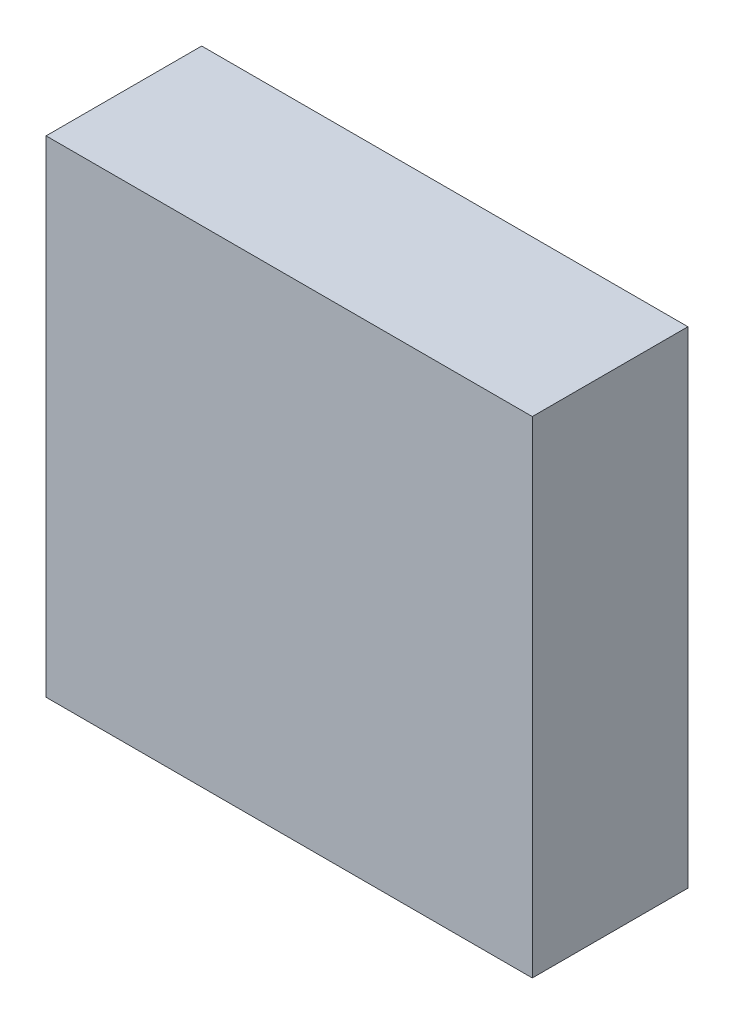
ISO-10303-21;
HEADER;
FILE_DESCRIPTION(('STEP AP214'),'2;1');
FILE_NAME('part.step','',(''),(''),'','','');
FILE_SCHEMA(('AUTOMOTIVE_DESIGN { 1 0 10303 214 1 1 1 1 }'));
ENDSEC;
DATA;
#1=APPLICATION_CONTEXT('core data for automotive mechanical design processes');
#2=APPLICATION_PROTOCOL_DEFINITION('international standard','automotive_design',2000,#1);
#3=PRODUCT_CONTEXT('',#1,'mechanical');
#4=PRODUCT('Part','Part','',(#3));
#5=PRODUCT_RELATED_PRODUCT_CATEGORY('part','',(#4));
#6=PRODUCT_DEFINITION_FORMATION('','',#4);
#7=PRODUCT_DEFINITION_CONTEXT('part definition',#1,'design');
#8=PRODUCT_DEFINITION('design','',#6,#7);
#9=PRODUCT_DEFINITION_SHAPE('','',#8);
#10=(LENGTH_UNIT() NAMED_UNIT(*) SI_UNIT(.MILLI.,.METRE.));
#11=(NAMED_UNIT(*) PLANE_ANGLE_UNIT() SI_UNIT($,.RADIAN.));
#12=(NAMED_UNIT(*) SI_UNIT($,.STERADIAN.) SOLID_ANGLE_UNIT());
#13=UNCERTAINTY_MEASURE_WITH_UNIT(LENGTH_MEASURE(1.E-05),#10,'distance_accuracy_value','');
#14=(GEOMETRIC_REPRESENTATION_CONTEXT(3) GLOBAL_UNCERTAINTY_ASSIGNED_CONTEXT((#13)) GLOBAL_UNIT_ASSIGNED_CONTEXT((#10,
#11,#12)) REPRESENTATION_CONTEXT('',''));
#15=CARTESIAN_POINT('',(0.,0.,0.));
#16=DIRECTION('',(0.,0.,1.));
#17=DIRECTION('',(1.,0.,0.));
#18=AXIS2_PLACEMENT_3D('',#15,#16,#17);
#19=CARTESIAN_POINT('',(2.499995,-2.49999754,1.59999934));
#20=DIRECTION('',(0.,0.,1.));
#21=DIRECTION('',(1.,0.,0.));
#22=AXIS2_PLACEMENT_3D('',#19,#20,#21);
#23=PLANE('',#22);
#24=DIRECTION('',(-5.08000758047034E-07,-0.999999999999871,0.));
#25=VECTOR('',#24,1.);
#26=CARTESIAN_POINT('',(-2.49999754,-2.499995,1.59999934));
#27=LINE('',#26,#25);
#28=CARTESIAN_POINT('',(-2.49999627,-2.499995,1.59999934));
#29=VERTEX_POINT('',#28);
#30=CARTESIAN_POINT('',(-2.499995,2.49999627,1.59999934));
#31=VERTEX_POINT('',#30);
#32=EDGE_CURVE('E53',#29,#31,#27,.F.);
#33=ORIENTED_EDGE('',*,*,#32,.F.);
#34=DIRECTION('',(0.999999999999871,-5.08000757336434E-07,0.));
#35=VECTOR('',#34,1.);
#36=CARTESIAN_POINT('',(2.499995,-2.49999754,1.59999934));
#37=LINE('',#36,#35);
#38=CARTESIAN_POINT('',(2.499995,-2.499996905,1.59999934));
#39=VERTEX_POINT('',#38);
#40=EDGE_CURVE('E68',#39,#29,#37,.F.);
#41=ORIENTED_EDGE('',*,*,#40,.F.);
#42=DIRECTION('',(5.08000757691735E-07,0.999999999999871,0.));
#43=VECTOR('',#42,1.);
#44=CARTESIAN_POINT('',(2.49999754,2.499995,1.59999934));
#45=LINE('',#44,#43);
#46=CARTESIAN_POINT('',(2.49999627,2.499995,1.59999934));
#47=VERTEX_POINT('',#46);
#48=EDGE_CURVE('E20',#47,#39,#45,.F.);
#49=ORIENTED_EDGE('',*,*,#48,.F.);
#50=DIRECTION('',(-0.999999999999871,5.08000757336434E-07,0.));
#51=VECTOR('',#50,1.);
#52=CARTESIAN_POINT('',(-2.499995,2.49999754,1.59999934));
#53=LINE('',#52,#51);
#54=EDGE_CURVE('E58',#31,#47,#53,.F.);
#55=ORIENTED_EDGE('',*,*,#54,.F.);
#56=EDGE_LOOP('',(#33,#41,#49,#55));
#57=FACE_BOUND('',#56,.T.);
#58=ADVANCED_FACE('F17',(#57),#23,.T.);
#59=CARTESIAN_POINT('',(2.49999754,2.499995,0.));
#60=DIRECTION('',(0.999999999999871,-5.08000757691735E-07,0.));
#61=DIRECTION('',(5.08000757691735E-07,0.999999999999871,0.));
#62=AXIS2_PLACEMENT_3D('',#59,#60,#61);
#63=PLANE('',#62);
#64=DIRECTION('',(0.,0.,1.));
#65=VECTOR('',#64,1.);
#66=CARTESIAN_POINT('',(2.499995,-2.49999754,0.));
#67=LINE('',#66,#65);
#68=CARTESIAN_POINT('',(2.499995,-2.499996905,0.));
#69=VERTEX_POINT('',#68);
#70=EDGE_CURVE('E79',#69,#39,#67,.T.);
#71=ORIENTED_EDGE('',*,*,#70,.F.);
#72=DIRECTION('',(0.,1.,0.));
#73=VECTOR('',#72,1.);
#74=CARTESIAN_POINT('',(2.499995,-2.49999754,0.));
#75=LINE('',#74,#73);
#76=CARTESIAN_POINT('',(2.499996905,2.499995,0.));
#77=VERTEX_POINT('',#76);
#78=EDGE_CURVE('E74',#69,#77,#75,.T.);
#79=ORIENTED_EDGE('',*,*,#78,.T.);
#80=DIRECTION('',(0.,0.,1.));
#81=VECTOR('',#80,1.);
#82=CARTESIAN_POINT('',(2.49999754,2.499995,0.));
#83=LINE('',#82,#81);
#84=EDGE_CURVE('E63',#47,#77,#83,.F.);
#85=ORIENTED_EDGE('',*,*,#84,.F.);
#86=ORIENTED_EDGE('',*,*,#48,.T.);
#87=EDGE_LOOP('',(#71,#79,#85,#86));
#88=FACE_BOUND('',#87,.T.);
#89=ADVANCED_FACE('F73',(#88),#63,.T.);
#90=CARTESIAN_POINT('',(-2.499995,2.49999754,0.));
#91=DIRECTION('',(5.08000757336434E-07,0.999999999999871,0.));
#92=DIRECTION('',(-0.999999999999871,5.08000757336434E-07,0.));
#93=AXIS2_PLACEMENT_3D('',#90,#91,#92);
#94=PLANE('',#93);
#95=ORIENTED_EDGE('',*,*,#84,.T.);
#96=DIRECTION('',(1.,0.,0.));
#97=VECTOR('',#96,1.);
#98=CARTESIAN_POINT('',(2.499995,2.499995,0.));
#99=LINE('',#98,#97);
#100=CARTESIAN_POINT('',(-2.499995,2.499996905,0.));
#101=VERTEX_POINT('',#100);
#102=EDGE_CURVE('E84',#77,#101,#99,.F.);
#103=ORIENTED_EDGE('',*,*,#102,.T.);
#104=DIRECTION('',(0.,0.,1.));
#105=VECTOR('',#104,1.);
#106=CARTESIAN_POINT('',(-2.499995,2.49999754,0.));
#107=LINE('',#106,#105);
#108=EDGE_CURVE('E65',#31,#101,#107,.F.);
#109=ORIENTED_EDGE('',*,*,#108,.F.);
#110=ORIENTED_EDGE('',*,*,#54,.T.);
#111=EDGE_LOOP('',(#95,#103,#109,#110));
#112=FACE_BOUND('',#111,.T.);
#113=ADVANCED_FACE('F60',(#112),#94,.T.);
#114=CARTESIAN_POINT('',(-2.49999754,-2.499995,0.));
#115=DIRECTION('',(-0.999999999999871,5.08000758047034E-07,0.));
#116=DIRECTION('',(-5.08000758047034E-07,-0.999999999999871,0.));
#117=AXIS2_PLACEMENT_3D('',#114,#115,#116);
#118=PLANE('',#117);
#119=ORIENTED_EDGE('',*,*,#108,.T.);
#120=DIRECTION('',(0.,1.,0.));
#121=VECTOR('',#120,1.);
#122=CARTESIAN_POINT('',(-2.499995,-2.49999754,0.));
#123=LINE('',#122,#121);
#124=CARTESIAN_POINT('',(-2.499996905,-2.499995,0.));
#125=VERTEX_POINT('',#124);
#126=EDGE_CURVE('E26',#101,#125,#123,.F.);
#127=ORIENTED_EDGE('',*,*,#126,.T.);
#128=DIRECTION('',(0.,0.,1.));
#129=VECTOR('',#128,1.);
#130=CARTESIAN_POINT('',(-2.49999754,-2.499995,0.));
#131=LINE('',#130,#129);
#132=EDGE_CURVE('E34',#29,#125,#131,.F.);
#133=ORIENTED_EDGE('',*,*,#132,.F.);
#134=ORIENTED_EDGE('',*,*,#32,.T.);
#135=EDGE_LOOP('',(#119,#127,#133,#134));
#136=FACE_BOUND('',#135,.T.);
#137=ADVANCED_FACE('F88',(#136),#118,.T.);
#138=CARTESIAN_POINT('',(2.499995,-2.49999754,0.));
#139=DIRECTION('',(-5.08000757336434E-07,-0.999999999999871,0.));
#140=DIRECTION('',(0.999999999999871,-5.08000757336434E-07,0.));
#141=AXIS2_PLACEMENT_3D('',#138,#139,#140);
#142=PLANE('',#141);
#143=ORIENTED_EDGE('',*,*,#132,.T.);
#144=DIRECTION('',(1.,0.,0.));
#145=VECTOR('',#144,1.);
#146=CARTESIAN_POINT('',(2.499995,-2.499995,0.));
#147=LINE('',#146,#145);
#148=EDGE_CURVE('E11',#125,#69,#147,.T.);
#149=ORIENTED_EDGE('',*,*,#148,.T.);
#150=ORIENTED_EDGE('',*,*,#70,.T.);
#151=ORIENTED_EDGE('',*,*,#40,.T.);
#152=EDGE_LOOP('',(#143,#149,#150,#151));
#153=FACE_BOUND('',#152,.T.);
#154=ADVANCED_FACE('F91',(#153),#142,.T.);
#155=CARTESIAN_POINT('',(2.499995,-2.49999754,0.));
#156=DIRECTION('',(0.,0.,1.));
#157=DIRECTION('',(1.,0.,0.));
#158=AXIS2_PLACEMENT_3D('',#155,#156,#157);
#159=PLANE('',#158);
#160=ORIENTED_EDGE('',*,*,#126,.F.);
#161=ORIENTED_EDGE('',*,*,#102,.F.);
#162=ORIENTED_EDGE('',*,*,#78,.F.);
#163=ORIENTED_EDGE('',*,*,#148,.F.);
#164=EDGE_LOOP('',(#160,#161,#162,#163));
#165=FACE_BOUND('',#164,.T.);
#166=ADVANCED_FACE('F90',(#165),#159,.F.);
#167=CLOSED_SHELL('',(#58,#89,#113,#137,#154,#166));
#168=MANIFOLD_SOLID_BREP('B1',#167);
#169=ADVANCED_BREP_SHAPE_REPRESENTATION('',(#18,#168),#14);
#170=SHAPE_DEFINITION_REPRESENTATION(#9,#169);
ENDSEC;
END-ISO-10303-21;
